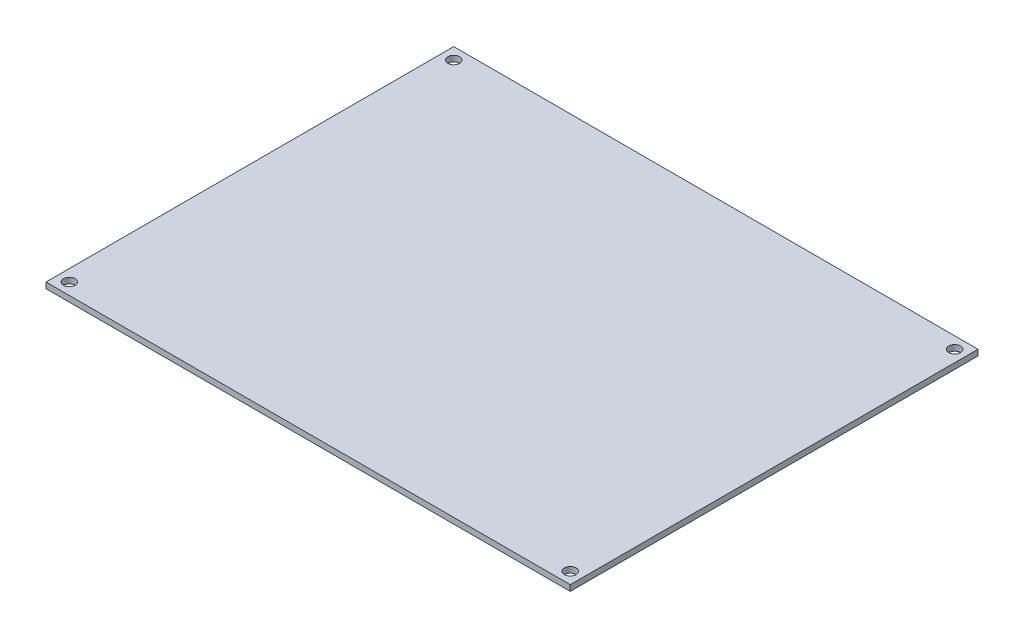
ISO-10303-21;
HEADER;
FILE_DESCRIPTION(('STEP AP214'),'2;1');
FILE_NAME('part.step','',(''),(''),'','','');
FILE_SCHEMA(('AUTOMOTIVE_DESIGN { 1 0 10303 214 1 1 1 1 }'));
ENDSEC;
DATA;
#1=APPLICATION_CONTEXT('core data for automotive mechanical design processes');
#2=APPLICATION_PROTOCOL_DEFINITION('international standard','automotive_design',2000,#1);
#3=PRODUCT_CONTEXT('',#1,'mechanical');
#4=PRODUCT('Part','Part','',(#3));
#5=PRODUCT_RELATED_PRODUCT_CATEGORY('part','',(#4));
#6=PRODUCT_DEFINITION_FORMATION('','',#4);
#7=PRODUCT_DEFINITION_CONTEXT('part definition',#1,'design');
#8=PRODUCT_DEFINITION('design','',#6,#7);
#9=PRODUCT_DEFINITION_SHAPE('','',#8);
#10=(LENGTH_UNIT() NAMED_UNIT(*) SI_UNIT(.MILLI.,.METRE.));
#11=(NAMED_UNIT(*) PLANE_ANGLE_UNIT() SI_UNIT($,.RADIAN.));
#12=(NAMED_UNIT(*) SI_UNIT($,.STERADIAN.) SOLID_ANGLE_UNIT());
#13=UNCERTAINTY_MEASURE_WITH_UNIT(LENGTH_MEASURE(1.E-05),#10,'distance_accuracy_value','');
#14=(GEOMETRIC_REPRESENTATION_CONTEXT(3) GLOBAL_UNCERTAINTY_ASSIGNED_CONTEXT((#13)) GLOBAL_UNIT_ASSIGNED_CONTEXT((#10,
#11,#12)) REPRESENTATION_CONTEXT('',''));
#15=CARTESIAN_POINT('',(0.,0.,0.));
#16=DIRECTION('',(0.,0.,1.));
#17=DIRECTION('',(1.,0.,0.));
#18=AXIS2_PLACEMENT_3D('',#15,#16,#17);
#19=CARTESIAN_POINT('',(0.,1.,0.));
#20=DIRECTION('',(1.,0.,0.));
#21=DIRECTION('',(0.,0.,-1.));
#22=AXIS2_PLACEMENT_3D('',#19,#20,#21);
#23=PLANE('',#22);
#24=DIRECTION('',(0.,0.,1.));
#25=VECTOR('',#24,1.);
#26=CARTESIAN_POINT('',(0.,0.,0.));
#27=LINE('',#26,#25);
#28=CARTESIAN_POINT('',(0.,0.,-70.));
#29=VERTEX_POINT('',#28);
#30=CARTESIAN_POINT('',(0.,0.,0.));
#31=VERTEX_POINT('',#30);
#32=EDGE_CURVE('E105',#29,#31,#27,.T.);
#33=ORIENTED_EDGE('',*,*,#32,.T.);
#34=DIRECTION('',(0.,-1.,0.));
#35=VECTOR('',#34,1.);
#36=CARTESIAN_POINT('',(0.,1.,0.));
#37=LINE('',#36,#35);
#38=CARTESIAN_POINT('',(0.,1.,0.));
#39=VERTEX_POINT('',#38);
#40=EDGE_CURVE('E11',#39,#31,#37,.T.);
#41=ORIENTED_EDGE('',*,*,#40,.F.);
#42=DIRECTION('',(0.,0.,1.));
#43=VECTOR('',#42,1.);
#44=CARTESIAN_POINT('',(0.,1.,0.));
#45=LINE('',#44,#43);
#46=CARTESIAN_POINT('',(0.,1.,-70.));
#47=VERTEX_POINT('',#46);
#48=EDGE_CURVE('E92',#47,#39,#45,.T.);
#49=ORIENTED_EDGE('',*,*,#48,.F.);
#50=DIRECTION('',(0.,-1.,0.));
#51=VECTOR('',#50,1.);
#52=CARTESIAN_POINT('',(0.,1.,-70.));
#53=LINE('',#52,#51);
#54=EDGE_CURVE('E101',#47,#29,#53,.T.);
#55=ORIENTED_EDGE('',*,*,#54,.T.);
#56=EDGE_LOOP('',(#33,#41,#49,#55));
#57=FACE_BOUND('',#56,.T.);
#58=ADVANCED_FACE('F39',(#57),#23,.F.);
#59=CARTESIAN_POINT('',(0.,1.,0.));
#60=DIRECTION('',(0.,0.,-1.));
#61=DIRECTION('',(-1.,0.,0.));
#62=AXIS2_PLACEMENT_3D('',#59,#60,#61);
#63=PLANE('',#62);
#64=DIRECTION('',(1.,0.,0.));
#65=VECTOR('',#64,1.);
#66=CARTESIAN_POINT('',(0.,0.,0.));
#67=LINE('',#66,#65);
#68=CARTESIAN_POINT('',(90.,0.,0.));
#69=VERTEX_POINT('',#68);
#70=EDGE_CURVE('E96',#31,#69,#67,.T.);
#71=ORIENTED_EDGE('',*,*,#70,.T.);
#72=DIRECTION('',(0.,-1.,0.));
#73=VECTOR('',#72,1.);
#74=CARTESIAN_POINT('',(90.,1.,0.));
#75=LINE('',#74,#73);
#76=CARTESIAN_POINT('',(90.,1.,0.));
#77=VERTEX_POINT('',#76);
#78=EDGE_CURVE('E48',#77,#69,#75,.T.);
#79=ORIENTED_EDGE('',*,*,#78,.F.);
#80=DIRECTION('',(1.,0.,0.));
#81=VECTOR('',#80,1.);
#82=CARTESIAN_POINT('',(0.,1.,0.));
#83=LINE('',#82,#81);
#84=EDGE_CURVE('E87',#39,#77,#83,.T.);
#85=ORIENTED_EDGE('',*,*,#84,.F.);
#86=ORIENTED_EDGE('',*,*,#40,.T.);
#87=EDGE_LOOP('',(#71,#79,#85,#86));
#88=FACE_BOUND('',#87,.T.);
#89=ADVANCED_FACE('F95',(#88),#63,.F.);
#90=CARTESIAN_POINT('',(90.,1.,0.));
#91=DIRECTION('',(-1.,0.,0.));
#92=DIRECTION('',(0.,0.,1.));
#93=AXIS2_PLACEMENT_3D('',#90,#91,#92);
#94=PLANE('',#93);
#95=DIRECTION('',(0.,0.,-1.));
#96=VECTOR('',#95,1.);
#97=CARTESIAN_POINT('',(90.,0.,0.));
#98=LINE('',#97,#96);
#99=CARTESIAN_POINT('',(90.,0.,-70.));
#100=VERTEX_POINT('',#99);
#101=EDGE_CURVE('E74',#69,#100,#98,.T.);
#102=ORIENTED_EDGE('',*,*,#101,.T.);
#103=DIRECTION('',(0.,-1.,0.));
#104=VECTOR('',#103,1.);
#105=CARTESIAN_POINT('',(90.,1.,-70.));
#106=LINE('',#105,#104);
#107=CARTESIAN_POINT('',(90.,1.,-70.));
#108=VERTEX_POINT('',#107);
#109=EDGE_CURVE('E97',#108,#100,#106,.T.);
#110=ORIENTED_EDGE('',*,*,#109,.F.);
#111=DIRECTION('',(0.,0.,-1.));
#112=VECTOR('',#111,1.);
#113=CARTESIAN_POINT('',(90.,1.,0.));
#114=LINE('',#113,#112);
#115=EDGE_CURVE('E90',#77,#108,#114,.T.);
#116=ORIENTED_EDGE('',*,*,#115,.F.);
#117=ORIENTED_EDGE('',*,*,#78,.T.);
#118=EDGE_LOOP('',(#102,#110,#116,#117));
#119=FACE_BOUND('',#118,.T.);
#120=ADVANCED_FACE('F99',(#119),#94,.F.);
#121=CARTESIAN_POINT('',(0.,1.,-70.));
#122=DIRECTION('',(0.,0.,1.));
#123=DIRECTION('',(1.,0.,0.));
#124=AXIS2_PLACEMENT_3D('',#121,#122,#123);
#125=PLANE('',#124);
#126=DIRECTION('',(-1.,0.,0.));
#127=VECTOR('',#126,1.);
#128=CARTESIAN_POINT('',(0.,0.,-70.));
#129=LINE('',#128,#127);
#130=EDGE_CURVE('E80',#100,#29,#129,.T.);
#131=ORIENTED_EDGE('',*,*,#130,.T.);
#132=ORIENTED_EDGE('',*,*,#54,.F.);
#133=DIRECTION('',(-1.,0.,0.));
#134=VECTOR('',#133,1.);
#135=CARTESIAN_POINT('',(0.,1.,-70.));
#136=LINE('',#135,#134);
#137=EDGE_CURVE('E57',#108,#47,#136,.T.);
#138=ORIENTED_EDGE('',*,*,#137,.F.);
#139=ORIENTED_EDGE('',*,*,#109,.T.);
#140=EDGE_LOOP('',(#131,#132,#138,#139));
#141=FACE_BOUND('',#140,.T.);
#142=ADVANCED_FACE('F141',(#141),#125,.F.);
#143=CARTESIAN_POINT('',(0.,1.,0.));
#144=DIRECTION('',(0.,-1.,0.));
#145=DIRECTION('',(0.,0.,-1.));
#146=AXIS2_PLACEMENT_3D('',#143,#144,#145);
#147=PLANE('',#146);
#148=CARTESIAN_POINT('',(2.,1.,-68.));
#149=DIRECTION('',(0.,1.,0.));
#150=DIRECTION('',(0.,0.,1.));
#151=AXIS2_PLACEMENT_3D('',#148,#149,#150);
#152=CIRCLE('',#151,1.);
#153=CARTESIAN_POINT('',(2.,1.,-67.));
#154=VERTEX_POINT('',#153);
#155=EDGE_CURVE('E249',#154,#154,#152,.T.);
#156=ORIENTED_EDGE('',*,*,#155,.F.);
#157=EDGE_LOOP('',(#156));
#158=FACE_BOUND('',#157,.T.);
#159=CARTESIAN_POINT('',(2.,1.,-2.00000000000001));
#160=DIRECTION('',(0.,1.,0.));
#161=DIRECTION('',(0.,0.,1.));
#162=AXIS2_PLACEMENT_3D('',#159,#160,#161);
#163=CIRCLE('',#162,1.);
#164=CARTESIAN_POINT('',(2.,1.,-1.00000000000001));
#165=VERTEX_POINT('',#164);
#166=EDGE_CURVE('E246',#165,#165,#163,.T.);
#167=ORIENTED_EDGE('',*,*,#166,.F.);
#168=EDGE_LOOP('',(#167));
#169=FACE_BOUND('',#168,.T.);
#170=CARTESIAN_POINT('',(88.,1.,-2.00000000000001));
#171=DIRECTION('',(0.,1.,0.));
#172=DIRECTION('',(0.,0.,1.));
#173=AXIS2_PLACEMENT_3D('',#170,#171,#172);
#174=CIRCLE('',#173,0.999999999999998);
#175=CARTESIAN_POINT('',(88.,1.,-1.00000000000001));
#176=VERTEX_POINT('',#175);
#177=EDGE_CURVE('E248',#176,#176,#174,.T.);
#178=ORIENTED_EDGE('',*,*,#177,.F.);
#179=EDGE_LOOP('',(#178));
#180=FACE_BOUND('',#179,.T.);
#181=CARTESIAN_POINT('',(88.,1.,-68.));
#182=DIRECTION('',(0.,1.,0.));
#183=DIRECTION('',(0.,0.,1.));
#184=AXIS2_PLACEMENT_3D('',#181,#182,#183);
#185=CIRCLE('',#184,0.999999999999998);
#186=CARTESIAN_POINT('',(88.,1.,-67.));
#187=VERTEX_POINT('',#186);
#188=EDGE_CURVE('E117',#187,#187,#185,.T.);
#189=ORIENTED_EDGE('',*,*,#188,.F.);
#190=EDGE_LOOP('',(#189));
#191=FACE_BOUND('',#190,.T.);
#192=ORIENTED_EDGE('',*,*,#48,.T.);
#193=ORIENTED_EDGE('',*,*,#84,.T.);
#194=ORIENTED_EDGE('',*,*,#115,.T.);
#195=ORIENTED_EDGE('',*,*,#137,.T.);
#196=EDGE_LOOP('',(#192,#193,#194,#195));
#197=FACE_BOUND('',#196,.T.);
#198=ADVANCED_FACE('F88',(#158,#169,#180,#191,#197),#147,.F.);
#199=CARTESIAN_POINT('',(0.,0.,0.));
#200=DIRECTION('',(0.,-1.,0.));
#201=DIRECTION('',(0.,0.,-1.));
#202=AXIS2_PLACEMENT_3D('',#199,#200,#201);
#203=PLANE('',#202);
#204=CARTESIAN_POINT('',(2.,0.,-68.));
#205=DIRECTION('',(0.,-1.,0.));
#206=DIRECTION('',(0.,0.,-1.));
#207=AXIS2_PLACEMENT_3D('',#204,#205,#206);
#208=CIRCLE('',#207,1.);
#209=CARTESIAN_POINT('',(2.,0.,-69.));
#210=VERTEX_POINT('',#209);
#211=EDGE_CURVE('E42',#210,#210,#208,.T.);
#212=ORIENTED_EDGE('',*,*,#211,.F.);
#213=EDGE_LOOP('',(#212));
#214=FACE_BOUND('',#213,.T.);
#215=CARTESIAN_POINT('',(2.,0.,-2.00000000000001));
#216=DIRECTION('',(0.,-1.,0.));
#217=DIRECTION('',(0.,0.,-1.));
#218=AXIS2_PLACEMENT_3D('',#215,#216,#217);
#219=CIRCLE('',#218,1.);
#220=CARTESIAN_POINT('',(2.,0.,-3.00000000000001));
#221=VERTEX_POINT('',#220);
#222=EDGE_CURVE('E119',#221,#221,#219,.T.);
#223=ORIENTED_EDGE('',*,*,#222,.F.);
#224=EDGE_LOOP('',(#223));
#225=FACE_BOUND('',#224,.T.);
#226=CARTESIAN_POINT('',(88.,0.,-2.00000000000001));
#227=DIRECTION('',(0.,-1.,0.));
#228=DIRECTION('',(0.,0.,-1.));
#229=AXIS2_PLACEMENT_3D('',#226,#227,#228);
#230=CIRCLE('',#229,0.999999999999998);
#231=CARTESIAN_POINT('',(88.,0.,-3.00000000000001));
#232=VERTEX_POINT('',#231);
#233=EDGE_CURVE('E116',#232,#232,#230,.T.);
#234=ORIENTED_EDGE('',*,*,#233,.F.);
#235=EDGE_LOOP('',(#234));
#236=FACE_BOUND('',#235,.T.);
#237=CARTESIAN_POINT('',(88.,0.,-68.));
#238=DIRECTION('',(0.,-1.,0.));
#239=DIRECTION('',(0.,0.,-1.));
#240=AXIS2_PLACEMENT_3D('',#237,#238,#239);
#241=CIRCLE('',#240,0.999999999999998);
#242=CARTESIAN_POINT('',(88.,0.,-69.));
#243=VERTEX_POINT('',#242);
#244=EDGE_CURVE('E113',#243,#243,#241,.T.);
#245=ORIENTED_EDGE('',*,*,#244,.F.);
#246=EDGE_LOOP('',(#245));
#247=FACE_BOUND('',#246,.T.);
#248=ORIENTED_EDGE('',*,*,#32,.F.);
#249=ORIENTED_EDGE('',*,*,#130,.F.);
#250=ORIENTED_EDGE('',*,*,#101,.F.);
#251=ORIENTED_EDGE('',*,*,#70,.F.);
#252=EDGE_LOOP('',(#248,#249,#250,#251));
#253=FACE_BOUND('',#252,.T.);
#254=ADVANCED_FACE('F129',(#214,#225,#236,#247,#253),#203,.T.);
#255=CARTESIAN_POINT('',(88.,-9.,-68.));
#256=DIRECTION('',(0.,1.,0.));
#257=DIRECTION('',(0.,0.,1.));
#258=AXIS2_PLACEMENT_3D('',#255,#256,#257);
#259=CYLINDRICAL_SURFACE('',#258,0.999999999999998);
#260=ORIENTED_EDGE('',*,*,#244,.T.);
#261=EDGE_LOOP('',(#260));
#262=FACE_BOUND('',#261,.T.);
#263=ORIENTED_EDGE('',*,*,#188,.T.);
#264=EDGE_LOOP('',(#263));
#265=FACE_BOUND('',#264,.T.);
#266=ADVANCED_FACE('F132',(#262,#265),#259,.F.);
#267=CARTESIAN_POINT('',(88.,-9.,-2.00000000000001));
#268=DIRECTION('',(0.,1.,0.));
#269=DIRECTION('',(0.,0.,1.));
#270=AXIS2_PLACEMENT_3D('',#267,#268,#269);
#271=CYLINDRICAL_SURFACE('',#270,0.999999999999998);
#272=ORIENTED_EDGE('',*,*,#233,.T.);
#273=EDGE_LOOP('',(#272));
#274=FACE_BOUND('',#273,.T.);
#275=ORIENTED_EDGE('',*,*,#177,.T.);
#276=EDGE_LOOP('',(#275));
#277=FACE_BOUND('',#276,.T.);
#278=ADVANCED_FACE('F190',(#274,#277),#271,.F.);
#279=CARTESIAN_POINT('',(2.,-9.,-2.00000000000001));
#280=DIRECTION('',(0.,1.,0.));
#281=DIRECTION('',(0.,0.,1.));
#282=AXIS2_PLACEMENT_3D('',#279,#280,#281);
#283=CYLINDRICAL_SURFACE('',#282,1.);
#284=ORIENTED_EDGE('',*,*,#222,.T.);
#285=EDGE_LOOP('',(#284));
#286=FACE_BOUND('',#285,.T.);
#287=ORIENTED_EDGE('',*,*,#166,.T.);
#288=EDGE_LOOP('',(#287));
#289=FACE_BOUND('',#288,.T.);
#290=ADVANCED_FACE('F201',(#286,#289),#283,.F.);
#291=CARTESIAN_POINT('',(2.,-9.,-68.));
#292=DIRECTION('',(0.,1.,0.));
#293=DIRECTION('',(0.,0.,1.));
#294=AXIS2_PLACEMENT_3D('',#291,#292,#293);
#295=CYLINDRICAL_SURFACE('',#294,1.);
#296=ORIENTED_EDGE('',*,*,#211,.T.);
#297=EDGE_LOOP('',(#296));
#298=FACE_BOUND('',#297,.T.);
#299=ORIENTED_EDGE('',*,*,#155,.T.);
#300=EDGE_LOOP('',(#299));
#301=FACE_BOUND('',#300,.T.);
#302=ADVANCED_FACE('F126',(#298,#301),#295,.F.);
#303=CLOSED_SHELL('',(#58,#89,#120,#142,#198,#254,#266,#278,#290,#302));
#304=MANIFOLD_SOLID_BREP('B2',#303);
#305=ADVANCED_BREP_SHAPE_REPRESENTATION('',(#18,#304),#14);
#306=SHAPE_DEFINITION_REPRESENTATION(#9,#305);
ENDSEC;
END-ISO-10303-21;
